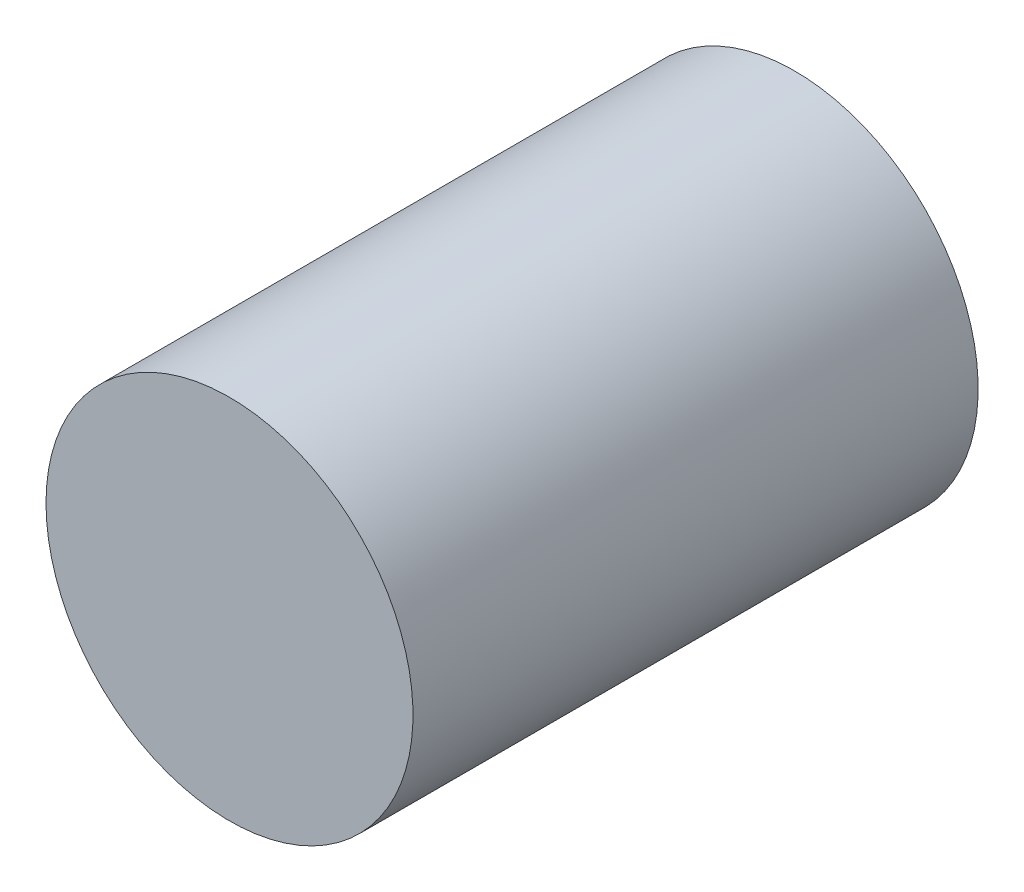
ISO-10303-21;
HEADER;
FILE_DESCRIPTION(('STEP AP214'),'2;1');
FILE_NAME('part.step','',(''),(''),'','','');
FILE_SCHEMA(('AUTOMOTIVE_DESIGN { 1 0 10303 214 1 1 1 1 }'));
ENDSEC;
DATA;
#1=APPLICATION_CONTEXT('core data for automotive mechanical design processes');
#2=APPLICATION_PROTOCOL_DEFINITION('international standard','automotive_design',2000,#1);
#3=PRODUCT_CONTEXT('',#1,'mechanical');
#4=PRODUCT('Part','Part','',(#3));
#5=PRODUCT_RELATED_PRODUCT_CATEGORY('part','',(#4));
#6=PRODUCT_DEFINITION_FORMATION('','',#4);
#7=PRODUCT_DEFINITION_CONTEXT('part definition',#1,'design');
#8=PRODUCT_DEFINITION('design','',#6,#7);
#9=PRODUCT_DEFINITION_SHAPE('','',#8);
#10=(LENGTH_UNIT() NAMED_UNIT(*) SI_UNIT(.MILLI.,.METRE.));
#11=(NAMED_UNIT(*) PLANE_ANGLE_UNIT() SI_UNIT($,.RADIAN.));
#12=(NAMED_UNIT(*) SI_UNIT($,.STERADIAN.) SOLID_ANGLE_UNIT());
#13=UNCERTAINTY_MEASURE_WITH_UNIT(LENGTH_MEASURE(1.E-05),#10,'distance_accuracy_value','');
#14=(GEOMETRIC_REPRESENTATION_CONTEXT(3) GLOBAL_UNCERTAINTY_ASSIGNED_CONTEXT((#13)) GLOBAL_UNIT_ASSIGNED_CONTEXT((#10,
#11,#12)) REPRESENTATION_CONTEXT('',''));
#15=CARTESIAN_POINT('',(0.,0.,0.));
#16=DIRECTION('',(0.,0.,1.));
#17=DIRECTION('',(1.,0.,0.));
#18=AXIS2_PLACEMENT_3D('',#15,#16,#17);
#19=CARTESIAN_POINT('',(-32.4665518581376,0.,-73.0366120133406));
#20=DIRECTION('',(0.,0.,-1.));
#21=DIRECTION('',(-1.,0.,0.));
#22=AXIS2_PLACEMENT_3D('',#19,#20,#21);
#23=PLANE('',#22);
#24=CARTESIAN_POINT('',(0.,0.,-73.0366120133406));
#25=DIRECTION('',(0.,0.,-1.));
#26=DIRECTION('',(-1.,0.,0.));
#27=AXIS2_PLACEMENT_3D('',#24,#25,#26);
#28=CIRCLE('',#27,32.4665518581376);
#29=CARTESIAN_POINT('',(-32.4665518581376,0.,-73.0366120133406));
#30=VERTEX_POINT('',#29);
#31=EDGE_CURVE('E71',#30,#30,#28,.T.);
#32=ORIENTED_EDGE('',*,*,#31,.T.);
#33=EDGE_LOOP('',(#32));
#34=FACE_BOUND('',#33,.T.);
#35=ADVANCED_FACE('F42',(#34),#23,.T.);
#36=CARTESIAN_POINT('',(0.,0.,26.9633879866594));
#37=DIRECTION('',(0.,0.,1.));
#38=DIRECTION('',(1.,0.,0.));
#39=AXIS2_PLACEMENT_3D('',#36,#37,#38);
#40=PLANE('',#39);
#41=CARTESIAN_POINT('',(0.,0.,26.9633879866594));
#42=DIRECTION('',(0.,0.,-1.));
#43=DIRECTION('',(-1.,0.,0.));
#44=AXIS2_PLACEMENT_3D('',#41,#42,#43);
#45=CIRCLE('',#44,32.4665518581376);
#46=CARTESIAN_POINT('',(-32.4665518581376,0.,26.9633879866594));
#47=VERTEX_POINT('',#46);
#48=EDGE_CURVE('E68',#47,#47,#45,.T.);
#49=ORIENTED_EDGE('',*,*,#48,.F.);
#50=EDGE_LOOP('',(#49));
#51=FACE_BOUND('',#50,.T.);
#52=ADVANCED_FACE('F78',(#51),#40,.T.);
#53=CARTESIAN_POINT('',(0.,0.,-5.03661201334064));
#54=DIRECTION('',(0.,0.,-1.));
#55=DIRECTION('',(-1.,0.,0.));
#56=AXIS2_PLACEMENT_3D('',#53,#54,#55);
#57=CYLINDRICAL_SURFACE('',#56,32.4665518581376);
#58=ORIENTED_EDGE('',*,*,#48,.T.);
#59=EDGE_LOOP('',(#58));
#60=FACE_BOUND('',#59,.T.);
#61=ORIENTED_EDGE('',*,*,#31,.F.);
#62=EDGE_LOOP('',(#61));
#63=FACE_BOUND('',#62,.T.);
#64=ADVANCED_FACE('F76',(#60,#63),#57,.T.);
#65=CLOSED_SHELL('',(#35,#52,#64));
#66=CARTESIAN_POINT('',(0.,0.,-41.0366120133406));
#67=DIRECTION('',(0.,0.,1.));
#68=DIRECTION('',(1.,0.,0.));
#69=AXIS2_PLACEMENT_3D('',#66,#67,#68);
#70=PLANE('',#69);
#71=CARTESIAN_POINT('',(0.,0.,-41.0366120133406));
#72=DIRECTION('',(0.,0.,-1.));
#73=DIRECTION('',(-1.,0.,0.));
#74=AXIS2_PLACEMENT_3D('',#71,#72,#73);
#75=CIRCLE('',#74,9.49999999999999);
#76=CARTESIAN_POINT('',(-9.49999999999999,0.,-41.0366120133406));
#77=VERTEX_POINT('',#76);
#78=EDGE_CURVE('E10',#77,#77,#75,.T.);
#79=ORIENTED_EDGE('',*,*,#78,.F.);
#80=EDGE_LOOP('',(#79));
#81=FACE_BOUND('',#80,.T.);
#82=ADVANCED_FACE('F99',(#81),#70,.T.);
#83=CARTESIAN_POINT('',(0.,0.,-5.03661201334064));
#84=DIRECTION('',(0.,0.,-1.));
#85=DIRECTION('',(-1.,0.,0.));
#86=AXIS2_PLACEMENT_3D('',#83,#84,#85);
#87=CYLINDRICAL_SURFACE('',#86,9.49999999999999);
#88=ORIENTED_EDGE('',*,*,#78,.T.);
#89=EDGE_LOOP('',(#88));
#90=FACE_BOUND('',#89,.T.);
#91=CARTESIAN_POINT('',(0.,0.,-38.0366120133406));
#92=DIRECTION('',(0.,0.,-1.));
#93=DIRECTION('',(-1.,0.,0.));
#94=AXIS2_PLACEMENT_3D('',#91,#92,#93);
#95=CIRCLE('',#94,9.49999999999999);
#96=CARTESIAN_POINT('',(-9.49999999999999,0.,-38.0366120133406));
#97=VERTEX_POINT('',#96);
#98=EDGE_CURVE('E49',#97,#97,#95,.T.);
#99=ORIENTED_EDGE('',*,*,#98,.F.);
#100=EDGE_LOOP('',(#99));
#101=FACE_BOUND('',#100,.T.);
#102=ADVANCED_FACE('F101',(#90,#101),#87,.F.);
#103=CARTESIAN_POINT('',(-9.49999999999999,0.,-38.0366120133406));
#104=DIRECTION('',(0.,0.,1.));
#105=DIRECTION('',(1.,0.,0.));
#106=AXIS2_PLACEMENT_3D('',#103,#104,#105);
#107=PLANE('',#106);
#108=ORIENTED_EDGE('',*,*,#98,.T.);
#109=EDGE_LOOP('',(#108));
#110=FACE_BOUND('',#109,.T.);
#111=CARTESIAN_POINT('',(0.,0.,-38.0366120133406));
#112=DIRECTION('',(0.,0.,-1.));
#113=DIRECTION('',(-1.,0.,0.));
#114=AXIS2_PLACEMENT_3D('',#111,#112,#113);
#115=CIRCLE('',#114,20.);
#116=CARTESIAN_POINT('',(-20.,0.,-38.0366120133406));
#117=VERTEX_POINT('',#116);
#118=EDGE_CURVE('E53',#117,#117,#115,.T.);
#119=ORIENTED_EDGE('',*,*,#118,.F.);
#120=EDGE_LOOP('',(#119));
#121=FACE_BOUND('',#120,.T.);
#122=ADVANCED_FACE('F109',(#110,#121),#107,.T.);
#123=CARTESIAN_POINT('',(0.,0.,-5.03661201334064));
#124=DIRECTION('',(0.,0.,-1.));
#125=DIRECTION('',(-1.,0.,0.));
#126=AXIS2_PLACEMENT_3D('',#123,#124,#125);
#127=CYLINDRICAL_SURFACE('',#126,20.);
#128=ORIENTED_EDGE('',*,*,#118,.T.);
#129=EDGE_LOOP('',(#128));
#130=FACE_BOUND('',#129,.T.);
#131=CARTESIAN_POINT('',(0.,0.,-8.03661201334064));
#132=DIRECTION('',(0.,0.,-1.));
#133=DIRECTION('',(-1.,0.,0.));
#134=AXIS2_PLACEMENT_3D('',#131,#132,#133);
#135=CIRCLE('',#134,20.);
#136=CARTESIAN_POINT('',(-20.,0.,-8.03661201334064));
#137=VERTEX_POINT('',#136);
#138=EDGE_CURVE('E57',#137,#137,#135,.T.);
#139=ORIENTED_EDGE('',*,*,#138,.F.);
#140=EDGE_LOOP('',(#139));
#141=FACE_BOUND('',#140,.T.);
#142=ADVANCED_FACE('F116',(#130,#141),#127,.F.);
#143=CARTESIAN_POINT('',(-20.,0.,-8.03661201334064));
#144=DIRECTION('',(0.,0.,-1.));
#145=DIRECTION('',(-1.,0.,0.));
#146=AXIS2_PLACEMENT_3D('',#143,#144,#145);
#147=PLANE('',#146);
#148=ORIENTED_EDGE('',*,*,#138,.T.);
#149=EDGE_LOOP('',(#148));
#150=FACE_BOUND('',#149,.T.);
#151=CARTESIAN_POINT('',(0.,0.,-8.03661201334064));
#152=DIRECTION('',(0.,0.,-1.));
#153=DIRECTION('',(-1.,0.,0.));
#154=AXIS2_PLACEMENT_3D('',#151,#152,#153);
#155=CIRCLE('',#154,9.5);
#156=CARTESIAN_POINT('',(-9.5,0.,-8.03661201334064));
#157=VERTEX_POINT('',#156);
#158=EDGE_CURVE('E62',#157,#157,#155,.T.);
#159=ORIENTED_EDGE('',*,*,#158,.F.);
#160=EDGE_LOOP('',(#159));
#161=FACE_BOUND('',#160,.T.);
#162=ADVANCED_FACE('F123',(#150,#161),#147,.T.);
#163=CARTESIAN_POINT('',(0.,0.,-5.03661201334064));
#164=DIRECTION('',(0.,0.,-1.));
#165=DIRECTION('',(-1.,0.,0.));
#166=AXIS2_PLACEMENT_3D('',#163,#164,#165);
#167=CYLINDRICAL_SURFACE('',#166,9.5);
#168=ORIENTED_EDGE('',*,*,#158,.T.);
#169=EDGE_LOOP('',(#168));
#170=FACE_BOUND('',#169,.T.);
#171=CARTESIAN_POINT('',(0.,0.,-5.03661201334064));
#172=DIRECTION('',(0.,0.,-1.));
#173=DIRECTION('',(-1.,0.,0.));
#174=AXIS2_PLACEMENT_3D('',#171,#172,#173);
#175=CIRCLE('',#174,9.5);
#176=CARTESIAN_POINT('',(-9.5,0.,-5.03661201334064));
#177=VERTEX_POINT('',#176);
#178=EDGE_CURVE('E65',#177,#177,#175,.T.);
#179=ORIENTED_EDGE('',*,*,#178,.F.);
#180=EDGE_LOOP('',(#179));
#181=FACE_BOUND('',#180,.T.);
#182=ADVANCED_FACE('F131',(#170,#181),#167,.F.);
#183=CARTESIAN_POINT('',(-9.5,0.,-5.03661201334064));
#184=DIRECTION('',(0.,0.,-1.));
#185=DIRECTION('',(-1.,0.,0.));
#186=AXIS2_PLACEMENT_3D('',#183,#184,#185);
#187=PLANE('',#186);
#188=ORIENTED_EDGE('',*,*,#178,.T.);
#189=EDGE_LOOP('',(#188));
#190=FACE_BOUND('',#189,.T.);
#191=ADVANCED_FACE('F139',(#190),#187,.T.);
#192=CLOSED_SHELL('',(#82,#102,#122,#142,#162,#182,#191));
#193=ORIENTED_CLOSED_SHELL('',*,#192,.T.);
#194=BREP_WITH_VOIDS('B2',#65,(#193));
#195=ADVANCED_BREP_SHAPE_REPRESENTATION('',(#18,#194),#14);
#196=SHAPE_DEFINITION_REPRESENTATION(#9,#195);
ENDSEC;
END-ISO-10303-21;
